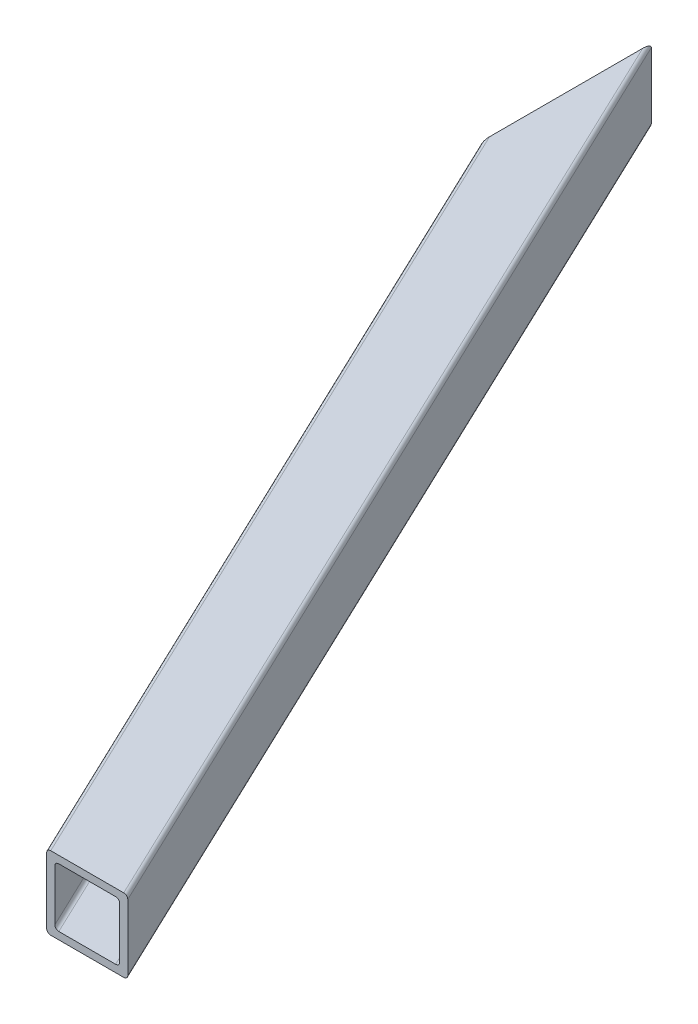
ISO-10303-21;
HEADER;
FILE_DESCRIPTION(('STEP AP214'),'2;1');
FILE_NAME('part.step','',(''),(''),'','','');
FILE_SCHEMA(('AUTOMOTIVE_DESIGN { 1 0 10303 214 1 1 1 1 }'));
ENDSEC;
DATA;
#1=APPLICATION_CONTEXT('core data for automotive mechanical design processes');
#2=APPLICATION_PROTOCOL_DEFINITION('international standard','automotive_design',2000,#1);
#3=PRODUCT_CONTEXT('',#1,'mechanical');
#4=PRODUCT('Part','Part','',(#3));
#5=PRODUCT_RELATED_PRODUCT_CATEGORY('part','',(#4));
#6=PRODUCT_DEFINITION_FORMATION('','',#4);
#7=PRODUCT_DEFINITION_CONTEXT('part definition',#1,'design');
#8=PRODUCT_DEFINITION('design','',#6,#7);
#9=PRODUCT_DEFINITION_SHAPE('','',#8);
#10=(LENGTH_UNIT() NAMED_UNIT(*) SI_UNIT(.MILLI.,.METRE.));
#11=(NAMED_UNIT(*) PLANE_ANGLE_UNIT() SI_UNIT($,.RADIAN.));
#12=(NAMED_UNIT(*) SI_UNIT($,.STERADIAN.) SOLID_ANGLE_UNIT());
#13=UNCERTAINTY_MEASURE_WITH_UNIT(LENGTH_MEASURE(1.E-05),#10,'distance_accuracy_value','');
#14=(GEOMETRIC_REPRESENTATION_CONTEXT(3) GLOBAL_UNCERTAINTY_ASSIGNED_CONTEXT((#13)) GLOBAL_UNIT_ASSIGNED_CONTEXT((#10,
#11,#12)) REPRESENTATION_CONTEXT('',''));
#15=CARTESIAN_POINT('',(0.,0.,0.));
#16=DIRECTION('',(0.,0.,1.));
#17=DIRECTION('',(1.,0.,0.));
#18=AXIS2_PLACEMENT_3D('',#15,#16,#17);
#19=CARTESIAN_POINT('',(0.,40.,-452.962373203096));
#20=DIRECTION('',(1.,0.,0.));
#21=DIRECTION('',(0.,0.,-1.));
#22=AXIS2_PLACEMENT_3D('',#19,#20,#21);
#23=PLANE('',#22);
#24=DIRECTION('',(0.,0.,-1.));
#25=VECTOR('',#24,1.);
#26=CARTESIAN_POINT('',(0.,4.,-452.962373203096));
#27=LINE('',#26,#25);
#28=CARTESIAN_POINT('',(0.,4.,-466.918017222632));
#29=VERTEX_POINT('',#28);
#30=CARTESIAN_POINT('',(0.,3.99999999999999,-532.044355980464));
#31=VERTEX_POINT('',#30);
#32=EDGE_CURVE('E254',#29,#31,#27,.T.);
#33=ORIENTED_EDGE('',*,*,#32,.T.);
#34=CARTESIAN_POINT('',(0.,6.,-532.044355980464));
#35=DIRECTION('',(1.,0.,0.));
#36=DIRECTION('',(0.,0.,-1.));
#37=AXIS2_PLACEMENT_3D('',#34,#35,#36);
#38=ELLIPSE('',#37,4.6518813398452,2.);
#39=CARTESIAN_POINT('',(0.,6.,-536.69623732031));
#40=VERTEX_POINT('',#39);
#41=EDGE_CURVE('E43',#31,#40,#38,.T.);
#42=ORIENTED_EDGE('',*,*,#41,.T.);
#43=DIRECTION('',(0.,1.,0.));
#44=VECTOR('',#43,1.);
#45=CARTESIAN_POINT('',(0.,40.,-536.69623732031));
#46=LINE('',#45,#44);
#47=CARTESIAN_POINT('',(0.,34.,-536.69623732031));
#48=VERTEX_POINT('',#47);
#49=EDGE_CURVE('E252',#40,#48,#46,.T.);
#50=ORIENTED_EDGE('',*,*,#49,.T.);
#51=CARTESIAN_POINT('',(0.,34.,-532.044355980465));
#52=DIRECTION('',(1.,0.,0.));
#53=DIRECTION('',(0.,0.,1.));
#54=AXIS2_PLACEMENT_3D('',#51,#52,#53);
#55=ELLIPSE('',#54,4.6518813398452,2.);
#56=CARTESIAN_POINT('',(0.,36.,-532.044355980464));
#57=VERTEX_POINT('',#56);
#58=EDGE_CURVE('E237',#48,#57,#55,.T.);
#59=ORIENTED_EDGE('',*,*,#58,.T.);
#60=DIRECTION('',(0.,0.,1.));
#61=VECTOR('',#60,1.);
#62=CARTESIAN_POINT('',(0.,36.,-452.962373203096));
#63=LINE('',#62,#61);
#64=CARTESIAN_POINT('',(0.,36.,-466.918017222632));
#65=VERTEX_POINT('',#64);
#66=EDGE_CURVE('E179',#57,#65,#63,.T.);
#67=ORIENTED_EDGE('',*,*,#66,.T.);
#68=CARTESIAN_POINT('',(0.,34.,-466.918017222632));
#69=DIRECTION('',(1.,0.,0.));
#70=DIRECTION('',(0.,0.,-1.));
#71=AXIS2_PLACEMENT_3D('',#68,#69,#70);
#72=ELLIPSE('',#71,4.6518813398452,2.);
#73=CARTESIAN_POINT('',(0.,34.,-462.266135882787));
#74=VERTEX_POINT('',#73);
#75=EDGE_CURVE('E243',#65,#74,#72,.T.);
#76=ORIENTED_EDGE('',*,*,#75,.T.);
#77=DIRECTION('',(0.,-1.,0.));
#78=VECTOR('',#77,1.);
#79=CARTESIAN_POINT('',(0.,40.,-462.266135882787));
#80=LINE('',#79,#78);
#81=CARTESIAN_POINT('',(0.,6.,-462.266135882787));
#82=VERTEX_POINT('',#81);
#83=EDGE_CURVE('E277',#74,#82,#80,.T.);
#84=ORIENTED_EDGE('',*,*,#83,.T.);
#85=CARTESIAN_POINT('',(0.,6.,-466.918017222632));
#86=DIRECTION('',(1.,0.,0.));
#87=DIRECTION('',(0.,0.,1.));
#88=AXIS2_PLACEMENT_3D('',#85,#86,#87);
#89=ELLIPSE('',#88,4.6518813398452,2.);
#90=EDGE_CURVE('E247',#82,#29,#89,.T.);
#91=ORIENTED_EDGE('',*,*,#90,.T.);
#92=EDGE_LOOP('',(#33,#42,#50,#59,#67,#76,#84,#91));
#93=FACE_BOUND('',#92,.T.);
#94=DIRECTION('',(0.,-1.,0.));
#95=VECTOR('',#94,1.);
#96=CARTESIAN_POINT('',(0.,40.,-452.962373203096));
#97=LINE('',#96,#95);
#98=CARTESIAN_POINT('',(0.,38.,-452.962373203096));
#99=VERTEX_POINT('',#98);
#100=CARTESIAN_POINT('',(0.,2.,-452.962373203096));
#101=VERTEX_POINT('',#100);
#102=EDGE_CURVE('E167',#99,#101,#97,.T.);
#103=ORIENTED_EDGE('',*,*,#102,.F.);
#104=CARTESIAN_POINT('',(0.,38.,-457.614254542941));
#105=DIRECTION('',(1.,0.,0.));
#106=DIRECTION('',(0.,0.,1.));
#107=AXIS2_PLACEMENT_3D('',#104,#105,#106);
#108=ELLIPSE('',#107,4.6518813398452,2.);
#109=CARTESIAN_POINT('',(0.,40.,-457.614254542941));
#110=VERTEX_POINT('',#109);
#111=EDGE_CURVE('E154',#99,#110,#108,.F.);
#112=ORIENTED_EDGE('',*,*,#111,.T.);
#113=DIRECTION('',(0.,0.,1.));
#114=VECTOR('',#113,1.);
#115=CARTESIAN_POINT('',(0.,40.,-452.962373203096));
#116=LINE('',#115,#114);
#117=CARTESIAN_POINT('',(0.,40.,-541.348118660155));
#118=VERTEX_POINT('',#117);
#119=EDGE_CURVE('E162',#118,#110,#116,.T.);
#120=ORIENTED_EDGE('',*,*,#119,.F.);
#121=CARTESIAN_POINT('',(0.,38.,-541.348118660155));
#122=DIRECTION('',(1.,0.,0.));
#123=DIRECTION('',(0.,0.,-1.));
#124=AXIS2_PLACEMENT_3D('',#121,#122,#123);
#125=ELLIPSE('',#124,4.6518813398452,2.);
#126=CARTESIAN_POINT('',(0.,38.,-546.));
#127=VERTEX_POINT('',#126);
#128=EDGE_CURVE('E58',#118,#127,#125,.F.);
#129=ORIENTED_EDGE('',*,*,#128,.T.);
#130=DIRECTION('',(0.,-1.,0.));
#131=VECTOR('',#130,1.);
#132=CARTESIAN_POINT('',(0.,40.,-546.));
#133=LINE('',#132,#131);
#134=CARTESIAN_POINT('',(0.,2.,-546.));
#135=VERTEX_POINT('',#134);
#136=EDGE_CURVE('E173',#127,#135,#133,.T.);
#137=ORIENTED_EDGE('',*,*,#136,.T.);
#138=CARTESIAN_POINT('',(0.,2.,-541.348118660155));
#139=DIRECTION('',(1.,0.,0.));
#140=DIRECTION('',(0.,0.,1.));
#141=AXIS2_PLACEMENT_3D('',#138,#139,#140);
#142=ELLIPSE('',#141,4.6518813398452,2.);
#143=CARTESIAN_POINT('',(0.,0.,-541.348118660155));
#144=VERTEX_POINT('',#143);
#145=EDGE_CURVE('E50',#135,#144,#142,.F.);
#146=ORIENTED_EDGE('',*,*,#145,.T.);
#147=DIRECTION('',(0.,0.,1.));
#148=VECTOR('',#147,1.);
#149=CARTESIAN_POINT('',(0.,0.,-452.962373203096));
#150=LINE('',#149,#148);
#151=CARTESIAN_POINT('',(0.,0.,-457.614254542941));
#152=VERTEX_POINT('',#151);
#153=EDGE_CURVE('E176',#144,#152,#150,.T.);
#154=ORIENTED_EDGE('',*,*,#153,.T.);
#155=CARTESIAN_POINT('',(0.,2.,-457.614254542941));
#156=DIRECTION('',(1.,0.,0.));
#157=DIRECTION('',(0.,0.,-1.));
#158=AXIS2_PLACEMENT_3D('',#155,#156,#157);
#159=ELLIPSE('',#158,4.6518813398452,2.);
#160=EDGE_CURVE('E155',#152,#101,#159,.F.);
#161=ORIENTED_EDGE('',*,*,#160,.T.);
#162=EDGE_LOOP('',(#103,#112,#120,#129,#137,#146,#154,#161));
#163=FACE_BOUND('',#162,.T.);
#164=ADVANCED_FACE('F35',(#93,#163),#23,.F.);
#165=CARTESIAN_POINT('',(0.,40.,-452.962373203096));
#166=DIRECTION('',(0.90286051882393,0.,-0.429933580392348));
#167=DIRECTION('',(-0.429933580392348,0.,-0.90286051882393));
#168=AXIS2_PLACEMENT_3D('',#165,#166,#167);
#169=PLANE('',#168);
#170=DIRECTION('',(0.,-1.,0.));
#171=VECTOR('',#170,1.);
#172=CARTESIAN_POINT('',(215.696368191951,40.,0.));
#173=LINE('',#172,#171);
#174=CARTESIAN_POINT('',(215.696368191951,38.,0.));
#175=VERTEX_POINT('',#174);
#176=CARTESIAN_POINT('',(215.696368191951,2.,0.));
#177=VERTEX_POINT('',#176);
#178=EDGE_CURVE('E188',#175,#177,#173,.T.);
#179=ORIENTED_EDGE('',*,*,#178,.F.);
#180=DIRECTION('',(0.429933580392348,0.,0.90286051882393));
#181=VECTOR('',#180,1.);
#182=CARTESIAN_POINT('',(0.,38.,-452.962373203096));
#183=LINE('',#182,#181);
#184=EDGE_CURVE('E205',#175,#99,#183,.F.);
#185=ORIENTED_EDGE('',*,*,#184,.T.);
#186=ORIENTED_EDGE('',*,*,#102,.T.);
#187=DIRECTION('',(0.429933580392348,0.,0.90286051882393));
#188=VECTOR('',#187,1.);
#189=CARTESIAN_POINT('',(215.696368191951,2.,0.));
#190=LINE('',#189,#188);
#191=EDGE_CURVE('E202',#101,#177,#190,.T.);
#192=ORIENTED_EDGE('',*,*,#191,.T.);
#193=EDGE_LOOP('',(#179,#185,#186,#192));
#194=FACE_BOUND('',#193,.T.);
#195=ADVANCED_FACE('F316',(#194),#169,.F.);
#196=CARTESIAN_POINT('',(215.696368191951,40.,0.));
#197=DIRECTION('',(0.,0.,-1.));
#198=DIRECTION('',(-1.,0.,0.));
#199=AXIS2_PLACEMENT_3D('',#196,#197,#198);
#200=PLANE('',#199);
#201=DIRECTION('',(-1.,0.,0.));
#202=VECTOR('',#201,1.);
#203=CARTESIAN_POINT('',(215.696368191951,4.,0.));
#204=LINE('',#203,#202);
#205=CARTESIAN_POINT('',(253.354455228793,3.99999999999999,0.));
#206=VERTEX_POINT('',#205);
#207=CARTESIAN_POINT('',(222.341912963158,4.,0.));
#208=VERTEX_POINT('',#207);
#209=EDGE_CURVE('E273',#206,#208,#204,.T.);
#210=ORIENTED_EDGE('',*,*,#209,.T.);
#211=CARTESIAN_POINT('',(222.341912963158,6.,0.));
#212=DIRECTION('',(0.,0.,-1.));
#213=DIRECTION('',(1.,0.,0.));
#214=AXIS2_PLACEMENT_3D('',#211,#212,#213);
#215=ELLIPSE('',#214,2.21518159040248,2.);
#216=CARTESIAN_POINT('',(220.126731372756,6.,0.));
#217=VERTEX_POINT('',#216);
#218=EDGE_CURVE('E245',#208,#217,#215,.T.);
#219=ORIENTED_EDGE('',*,*,#218,.T.);
#220=DIRECTION('',(0.,1.,0.));
#221=VECTOR('',#220,1.);
#222=CARTESIAN_POINT('',(220.126731372756,40.,0.));
#223=LINE('',#222,#221);
#224=CARTESIAN_POINT('',(220.126731372756,34.,0.));
#225=VERTEX_POINT('',#224);
#226=EDGE_CURVE('E263',#217,#225,#223,.T.);
#227=ORIENTED_EDGE('',*,*,#226,.T.);
#228=CARTESIAN_POINT('',(222.341912963158,34.,0.));
#229=DIRECTION('',(0.,0.,-1.));
#230=DIRECTION('',(-1.,0.,0.));
#231=AXIS2_PLACEMENT_3D('',#228,#229,#230);
#232=ELLIPSE('',#231,2.21518159040248,2.);
#233=CARTESIAN_POINT('',(222.341912963158,36.,0.));
#234=VERTEX_POINT('',#233);
#235=EDGE_CURVE('E241',#225,#234,#232,.T.);
#236=ORIENTED_EDGE('',*,*,#235,.T.);
#237=DIRECTION('',(1.,0.,0.));
#238=VECTOR('',#237,1.);
#239=CARTESIAN_POINT('',(215.696368191951,36.,0.));
#240=LINE('',#239,#238);
#241=CARTESIAN_POINT('',(253.354455228793,36.,0.));
#242=VERTEX_POINT('',#241);
#243=EDGE_CURVE('E279',#234,#242,#240,.T.);
#244=ORIENTED_EDGE('',*,*,#243,.T.);
#245=CARTESIAN_POINT('',(253.354455228793,34.,0.));
#246=DIRECTION('',(0.,0.,-1.));
#247=DIRECTION('',(1.,0.,0.));
#248=AXIS2_PLACEMENT_3D('',#245,#246,#247);
#249=ELLIPSE('',#248,2.21518159040248,2.);
#250=CARTESIAN_POINT('',(255.569636819195,34.,0.));
#251=VERTEX_POINT('',#250);
#252=EDGE_CURVE('E239',#242,#251,#249,.T.);
#253=ORIENTED_EDGE('',*,*,#252,.T.);
#254=DIRECTION('',(0.,-1.,0.));
#255=VECTOR('',#254,1.);
#256=CARTESIAN_POINT('',(255.569636819195,40.,0.));
#257=LINE('',#256,#255);
#258=CARTESIAN_POINT('',(255.569636819195,6.,0.));
#259=VERTEX_POINT('',#258);
#260=EDGE_CURVE('E264',#251,#259,#257,.T.);
#261=ORIENTED_EDGE('',*,*,#260,.T.);
#262=CARTESIAN_POINT('',(253.354455228793,6.,0.));
#263=DIRECTION('',(0.,0.,-1.));
#264=DIRECTION('',(-1.,0.,0.));
#265=AXIS2_PLACEMENT_3D('',#262,#263,#264);
#266=ELLIPSE('',#265,2.21518159040248,2.);
#267=EDGE_CURVE('E11',#259,#206,#266,.T.);
#268=ORIENTED_EDGE('',*,*,#267,.T.);
#269=EDGE_LOOP('',(#210,#219,#227,#236,#244,#253,#261,#268));
#270=FACE_BOUND('',#269,.T.);
#271=DIRECTION('',(1.,0.,0.));
#272=VECTOR('',#271,1.);
#273=CARTESIAN_POINT('',(215.696368191951,40.,0.));
#274=LINE('',#273,#272);
#275=CARTESIAN_POINT('',(217.911549782353,40.,0.));
#276=VERTEX_POINT('',#275);
#277=CARTESIAN_POINT('',(257.784818409598,40.,0.));
#278=VERTEX_POINT('',#277);
#279=EDGE_CURVE('E165',#276,#278,#274,.T.);
#280=ORIENTED_EDGE('',*,*,#279,.F.);
#281=CARTESIAN_POINT('',(217.911549782353,38.,0.));
#282=DIRECTION('',(0.,0.,-1.));
#283=DIRECTION('',(1.,0.,0.));
#284=AXIS2_PLACEMENT_3D('',#281,#282,#283);
#285=ELLIPSE('',#284,2.21518159040248,2.);
#286=EDGE_CURVE('E200',#276,#175,#285,.F.);
#287=ORIENTED_EDGE('',*,*,#286,.T.);
#288=ORIENTED_EDGE('',*,*,#178,.T.);
#289=CARTESIAN_POINT('',(217.911549782353,2.,0.));
#290=DIRECTION('',(0.,0.,-1.));
#291=DIRECTION('',(-1.,0.,0.));
#292=AXIS2_PLACEMENT_3D('',#289,#290,#291);
#293=ELLIPSE('',#292,2.21518159040248,2.);
#294=CARTESIAN_POINT('',(217.911549782353,0.,0.));
#295=VERTEX_POINT('',#294);
#296=EDGE_CURVE('E196',#177,#295,#293,.F.);
#297=ORIENTED_EDGE('',*,*,#296,.T.);
#298=DIRECTION('',(1.,0.,0.));
#299=VECTOR('',#298,1.);
#300=CARTESIAN_POINT('',(215.696368191951,0.,0.));
#301=LINE('',#300,#299);
#302=CARTESIAN_POINT('',(257.784818409598,0.,0.));
#303=VERTEX_POINT('',#302);
#304=EDGE_CURVE('E171',#295,#303,#301,.T.);
#305=ORIENTED_EDGE('',*,*,#304,.T.);
#306=CARTESIAN_POINT('',(257.784818409598,2.,0.));
#307=DIRECTION('',(0.,0.,-1.));
#308=DIRECTION('',(1.,0.,0.));
#309=AXIS2_PLACEMENT_3D('',#306,#307,#308);
#310=ELLIPSE('',#309,2.21518159040248,2.);
#311=CARTESIAN_POINT('',(260.,2.,0.));
#312=VERTEX_POINT('',#311);
#313=EDGE_CURVE('E194',#303,#312,#310,.F.);
#314=ORIENTED_EDGE('',*,*,#313,.T.);
#315=DIRECTION('',(0.,-1.,0.));
#316=VECTOR('',#315,1.);
#317=CARTESIAN_POINT('',(260.,40.,0.));
#318=LINE('',#317,#316);
#319=CARTESIAN_POINT('',(260.,38.,0.));
#320=VERTEX_POINT('',#319);
#321=EDGE_CURVE('E185',#320,#312,#318,.T.);
#322=ORIENTED_EDGE('',*,*,#321,.F.);
#323=CARTESIAN_POINT('',(257.784818409598,38.,0.));
#324=DIRECTION('',(0.,0.,-1.));
#325=DIRECTION('',(-1.,0.,0.));
#326=AXIS2_PLACEMENT_3D('',#323,#324,#325);
#327=ELLIPSE('',#326,2.21518159040248,2.);
#328=EDGE_CURVE('E198',#320,#278,#327,.F.);
#329=ORIENTED_EDGE('',*,*,#328,.T.);
#330=EDGE_LOOP('',(#280,#287,#288,#297,#305,#314,#322,#329));
#331=FACE_BOUND('',#330,.T.);
#332=ADVANCED_FACE('F271',(#270,#331),#200,.F.);
#333=CARTESIAN_POINT('',(260.,40.,0.));
#334=DIRECTION('',(-0.90286051882393,0.,0.429933580392348));
#335=DIRECTION('',(0.429933580392348,0.,0.90286051882393));
#336=AXIS2_PLACEMENT_3D('',#333,#334,#335);
#337=PLANE('',#336);
#338=ORIENTED_EDGE('',*,*,#136,.F.);
#339=DIRECTION('',(-0.429933580392348,0.,-0.90286051882393));
#340=VECTOR('',#339,1.);
#341=CARTESIAN_POINT('',(260.,38.,0.));
#342=LINE('',#341,#340);
#343=EDGE_CURVE('E153',#127,#320,#342,.F.);
#344=ORIENTED_EDGE('',*,*,#343,.T.);
#345=ORIENTED_EDGE('',*,*,#321,.T.);
#346=DIRECTION('',(-0.429933580392348,0.,-0.90286051882393));
#347=VECTOR('',#346,1.);
#348=CARTESIAN_POINT('',(0.,2.,-546.));
#349=LINE('',#348,#347);
#350=EDGE_CURVE('E230',#312,#135,#349,.T.);
#351=ORIENTED_EDGE('',*,*,#350,.T.);
#352=EDGE_LOOP('',(#338,#344,#345,#351));
#353=FACE_BOUND('',#352,.T.);
#354=ADVANCED_FACE('F391',(#353),#337,.F.);
#355=CARTESIAN_POINT('',(0.,40.,0.));
#356=DIRECTION('',(0.,-1.,0.));
#357=DIRECTION('',(0.,0.,-1.));
#358=AXIS2_PLACEMENT_3D('',#355,#356,#357);
#359=PLANE('',#358);
#360=ORIENTED_EDGE('',*,*,#119,.T.);
#361=DIRECTION('',(0.429933580392348,0.,0.90286051882393));
#362=VECTOR('',#361,1.);
#363=CARTESIAN_POINT('',(177.632150561955,40.,-84.5867383628358));
#364=LINE('',#363,#362);
#365=EDGE_CURVE('E166',#110,#276,#364,.T.);
#366=ORIENTED_EDGE('',*,*,#365,.T.);
#367=ORIENTED_EDGE('',*,*,#279,.T.);
#368=DIRECTION('',(-0.429933580392348,0.,-0.90286051882393));
#369=VECTOR('',#368,1.);
#370=CARTESIAN_POINT('',(210.135129239617,40.,-100.06434725696));
#371=LINE('',#370,#369);
#372=EDGE_CURVE('E152',#278,#118,#371,.T.);
#373=ORIENTED_EDGE('',*,*,#372,.T.);
#374=EDGE_LOOP('',(#360,#366,#367,#373));
#375=FACE_BOUND('',#374,.T.);
#376=ADVANCED_FACE('F160',(#375),#359,.F.);
#377=CARTESIAN_POINT('',(0.,0.,0.));
#378=DIRECTION('',(0.,-1.,0.));
#379=DIRECTION('',(0.,0.,-1.));
#380=AXIS2_PLACEMENT_3D('',#377,#378,#379);
#381=PLANE('',#380);
#382=ORIENTED_EDGE('',*,*,#304,.F.);
#383=DIRECTION('',(0.429933580392348,0.,0.90286051882393));
#384=VECTOR('',#383,1.);
#385=CARTESIAN_POINT('',(1.80572103764785,0.,-453.822240363881));
#386=LINE('',#385,#384);
#387=EDGE_CURVE('E235',#295,#152,#386,.F.);
#388=ORIENTED_EDGE('',*,*,#387,.T.);
#389=ORIENTED_EDGE('',*,*,#153,.F.);
#390=DIRECTION('',(-0.429933580392348,0.,-0.90286051882393));
#391=VECTOR('',#390,1.);
#392=CARTESIAN_POINT('',(258.194278962352,0.,0.859867160784698));
#393=LINE('',#392,#391);
#394=EDGE_CURVE('E233',#144,#303,#393,.F.);
#395=ORIENTED_EDGE('',*,*,#394,.T.);
#396=EDGE_LOOP('',(#382,#388,#389,#395));
#397=FACE_BOUND('',#396,.T.);
#398=ADVANCED_FACE('F327',(#397),#381,.T.);
#399=CARTESIAN_POINT('',(3.61144207529572,40.,-454.682107524665));
#400=DIRECTION('',(0.90286051882393,0.,-0.429933580392348));
#401=DIRECTION('',(-0.429933580392348,0.,-0.90286051882393));
#402=AXIS2_PLACEMENT_3D('',#399,#400,#401);
#403=PLANE('',#402);
#404=ORIENTED_EDGE('',*,*,#83,.F.);
#405=DIRECTION('',(0.429933580392348,0.,0.90286051882393));
#406=VECTOR('',#405,1.);
#407=CARTESIAN_POINT('',(220.126731372756,34.,0.));
#408=LINE('',#407,#406);
#409=EDGE_CURVE('E221',#74,#225,#408,.T.);
#410=ORIENTED_EDGE('',*,*,#409,.T.);
#411=ORIENTED_EDGE('',*,*,#226,.F.);
#412=DIRECTION('',(0.429933580392348,0.,0.90286051882393));
#413=VECTOR('',#412,1.);
#414=CARTESIAN_POINT('',(3.61144207529572,6.,-454.682107524665));
#415=LINE('',#414,#413);
#416=EDGE_CURVE('E219',#217,#82,#415,.F.);
#417=ORIENTED_EDGE('',*,*,#416,.T.);
#418=EDGE_LOOP('',(#404,#410,#411,#417));
#419=FACE_BOUND('',#418,.T.);
#420=ADVANCED_FACE('F300',(#419),#403,.T.);
#421=CARTESIAN_POINT('',(256.388557924704,40.,1.71973432156939));
#422=DIRECTION('',(-0.90286051882393,0.,0.429933580392348));
#423=DIRECTION('',(0.429933580392348,0.,0.90286051882393));
#424=AXIS2_PLACEMENT_3D('',#421,#422,#423);
#425=PLANE('',#424);
#426=ORIENTED_EDGE('',*,*,#260,.F.);
#427=DIRECTION('',(-0.429933580392348,0.,-0.90286051882393));
#428=VECTOR('',#427,1.);
#429=CARTESIAN_POINT('',(0.,34.,-536.69623732031));
#430=LINE('',#429,#428);
#431=EDGE_CURVE('E212',#251,#48,#430,.T.);
#432=ORIENTED_EDGE('',*,*,#431,.T.);
#433=ORIENTED_EDGE('',*,*,#49,.F.);
#434=DIRECTION('',(-0.429933580392348,0.,-0.90286051882393));
#435=VECTOR('',#434,1.);
#436=CARTESIAN_POINT('',(256.388557924704,6.,1.71973432156939));
#437=LINE('',#436,#435);
#438=EDGE_CURVE('E210',#40,#259,#437,.F.);
#439=ORIENTED_EDGE('',*,*,#438,.T.);
#440=EDGE_LOOP('',(#426,#432,#433,#439));
#441=FACE_BOUND('',#440,.T.);
#442=ADVANCED_FACE('F260',(#441),#425,.T.);
#443=CARTESIAN_POINT('',(0.,36.,0.));
#444=DIRECTION('',(0.,-1.,0.));
#445=DIRECTION('',(0.,0.,-1.));
#446=AXIS2_PLACEMENT_3D('',#443,#444,#445);
#447=PLANE('',#446);
#448=ORIENTED_EDGE('',*,*,#66,.F.);
#449=DIRECTION('',(-0.429933580392348,0.,-0.90286051882393));
#450=VECTOR('',#449,1.);
#451=CARTESIAN_POINT('',(253.763915781547,36.,0.859867160784731));
#452=LINE('',#451,#450);
#453=EDGE_CURVE('E217',#57,#242,#452,.F.);
#454=ORIENTED_EDGE('',*,*,#453,.T.);
#455=ORIENTED_EDGE('',*,*,#243,.F.);
#456=DIRECTION('',(0.429933580392348,0.,0.90286051882393));
#457=VECTOR('',#456,1.);
#458=CARTESIAN_POINT('',(1.80572103764783,36.,-463.126003043571));
#459=LINE('',#458,#457);
#460=EDGE_CURVE('E215',#234,#65,#459,.F.);
#461=ORIENTED_EDGE('',*,*,#460,.T.);
#462=EDGE_LOOP('',(#448,#454,#455,#461));
#463=FACE_BOUND('',#462,.T.);
#464=ADVANCED_FACE('F330',(#463),#447,.T.);
#465=CARTESIAN_POINT('',(0.,4.,0.));
#466=DIRECTION('',(0.,-1.,0.));
#467=DIRECTION('',(0.,0.,-1.));
#468=AXIS2_PLACEMENT_3D('',#465,#466,#467);
#469=PLANE('',#468);
#470=ORIENTED_EDGE('',*,*,#32,.F.);
#471=DIRECTION('',(0.429933580392348,0.,0.90286051882393));
#472=VECTOR('',#471,1.);
#473=CARTESIAN_POINT('',(181.243592637251,4.,-86.3064726844052));
#474=LINE('',#473,#472);
#475=EDGE_CURVE('E227',#29,#208,#474,.T.);
#476=ORIENTED_EDGE('',*,*,#475,.T.);
#477=ORIENTED_EDGE('',*,*,#209,.F.);
#478=DIRECTION('',(-0.429933580392348,0.,-0.90286051882393));
#479=VECTOR('',#478,1.);
#480=CARTESIAN_POINT('',(206.523687164321,4.,-98.3446129353908));
#481=LINE('',#480,#479);
#482=EDGE_CURVE('E224',#206,#31,#481,.T.);
#483=ORIENTED_EDGE('',*,*,#482,.T.);
#484=EDGE_LOOP('',(#470,#476,#477,#483));
#485=FACE_BOUND('',#484,.T.);
#486=ADVANCED_FACE('F275',(#485),#469,.F.);
#487=CARTESIAN_POINT('',(177.632150561955,38.,-84.5867383628357));
#488=DIRECTION('',(0.429933580392348,0.,0.90286051882393));
#489=DIRECTION('',(0.90286051882393,0.,-0.429933580392348));
#490=AXIS2_PLACEMENT_3D('',#487,#488,#489);
#491=CYLINDRICAL_SURFACE('',#490,2.);
#492=ORIENTED_EDGE('',*,*,#111,.F.);
#493=ORIENTED_EDGE('',*,*,#184,.F.);
#494=ORIENTED_EDGE('',*,*,#286,.F.);
#495=ORIENTED_EDGE('',*,*,#365,.F.);
#496=EDGE_LOOP('',(#492,#493,#494,#495));
#497=FACE_BOUND('',#496,.T.);
#498=ADVANCED_FACE('F335',(#497),#491,.T.);
#499=CARTESIAN_POINT('',(254.582836887056,34.,2.57960148235409));
#500=DIRECTION('',(0.429933580392348,0.,0.90286051882393));
#501=DIRECTION('',(0.90286051882393,0.,-0.429933580392348));
#502=AXIS2_PLACEMENT_3D('',#499,#500,#501);
#503=CYLINDRICAL_SURFACE('',#502,2.);
#504=ORIENTED_EDGE('',*,*,#252,.F.);
#505=ORIENTED_EDGE('',*,*,#453,.F.);
#506=ORIENTED_EDGE('',*,*,#58,.F.);
#507=ORIENTED_EDGE('',*,*,#431,.F.);
#508=EDGE_LOOP('',(#504,#505,#506,#507));
#509=FACE_BOUND('',#508,.T.);
#510=ADVANCED_FACE('F313',(#509),#503,.F.);
#511=CARTESIAN_POINT('',(5.41716311294358,34.,-455.54197468545));
#512=DIRECTION('',(-0.429933580392348,0.,-0.90286051882393));
#513=DIRECTION('',(-0.90286051882393,0.,0.429933580392348));
#514=AXIS2_PLACEMENT_3D('',#511,#512,#513);
#515=CYLINDRICAL_SURFACE('',#514,2.);
#516=ORIENTED_EDGE('',*,*,#75,.F.);
#517=ORIENTED_EDGE('',*,*,#460,.F.);
#518=ORIENTED_EDGE('',*,*,#235,.F.);
#519=ORIENTED_EDGE('',*,*,#409,.F.);
#520=EDGE_LOOP('',(#516,#517,#518,#519));
#521=FACE_BOUND('',#520,.T.);
#522=ADVANCED_FACE('F296',(#521),#515,.F.);
#523=CARTESIAN_POINT('',(181.243592637251,6.,-86.3064726844052));
#524=DIRECTION('',(0.429933580392348,0.,0.90286051882393));
#525=DIRECTION('',(0.90286051882393,0.,-0.429933580392348));
#526=AXIS2_PLACEMENT_3D('',#523,#524,#525);
#527=CYLINDRICAL_SURFACE('',#526,2.);
#528=ORIENTED_EDGE('',*,*,#90,.F.);
#529=ORIENTED_EDGE('',*,*,#416,.F.);
#530=ORIENTED_EDGE('',*,*,#218,.F.);
#531=ORIENTED_EDGE('',*,*,#475,.F.);
#532=EDGE_LOOP('',(#528,#529,#530,#531));
#533=FACE_BOUND('',#532,.T.);
#534=ADVANCED_FACE('F305',(#533),#527,.F.);
#535=CARTESIAN_POINT('',(206.523687164321,6.,-98.3446129353908));
#536=DIRECTION('',(-0.429933580392348,0.,-0.90286051882393));
#537=DIRECTION('',(-0.90286051882393,0.,0.429933580392348));
#538=AXIS2_PLACEMENT_3D('',#535,#536,#537);
#539=CYLINDRICAL_SURFACE('',#538,2.);
#540=ORIENTED_EDGE('',*,*,#267,.F.);
#541=ORIENTED_EDGE('',*,*,#438,.F.);
#542=ORIENTED_EDGE('',*,*,#41,.F.);
#543=ORIENTED_EDGE('',*,*,#482,.F.);
#544=EDGE_LOOP('',(#540,#541,#542,#543));
#545=FACE_BOUND('',#544,.T.);
#546=ADVANCED_FACE('F267',(#545),#539,.F.);
#547=CARTESIAN_POINT('',(210.135129239617,38.,-100.06434725696));
#548=DIRECTION('',(-0.429933580392348,0.,-0.90286051882393));
#549=DIRECTION('',(-0.90286051882393,0.,0.429933580392348));
#550=AXIS2_PLACEMENT_3D('',#547,#548,#549);
#551=CYLINDRICAL_SURFACE('',#550,2.);
#552=ORIENTED_EDGE('',*,*,#328,.F.);
#553=ORIENTED_EDGE('',*,*,#343,.F.);
#554=ORIENTED_EDGE('',*,*,#128,.F.);
#555=ORIENTED_EDGE('',*,*,#372,.F.);
#556=EDGE_LOOP('',(#552,#553,#554,#555));
#557=FACE_BOUND('',#556,.T.);
#558=ADVANCED_FACE('F151',(#557),#551,.T.);
#559=CARTESIAN_POINT('',(1.80572103764786,2.,-453.822240363881));
#560=DIRECTION('',(-0.429933580392348,0.,-0.90286051882393));
#561=DIRECTION('',(-0.90286051882393,0.,0.429933580392348));
#562=AXIS2_PLACEMENT_3D('',#559,#560,#561);
#563=CYLINDRICAL_SURFACE('',#562,2.);
#564=ORIENTED_EDGE('',*,*,#160,.F.);
#565=ORIENTED_EDGE('',*,*,#387,.F.);
#566=ORIENTED_EDGE('',*,*,#296,.F.);
#567=ORIENTED_EDGE('',*,*,#191,.F.);
#568=EDGE_LOOP('',(#564,#565,#566,#567));
#569=FACE_BOUND('',#568,.T.);
#570=ADVANCED_FACE('F368',(#569),#563,.T.);
#571=CARTESIAN_POINT('',(258.194278962352,2.,0.859867160784695));
#572=DIRECTION('',(0.429933580392348,0.,0.90286051882393));
#573=DIRECTION('',(0.90286051882393,0.,-0.429933580392348));
#574=AXIS2_PLACEMENT_3D('',#571,#572,#573);
#575=CYLINDRICAL_SURFACE('',#574,2.);
#576=ORIENTED_EDGE('',*,*,#313,.F.);
#577=ORIENTED_EDGE('',*,*,#394,.F.);
#578=ORIENTED_EDGE('',*,*,#145,.F.);
#579=ORIENTED_EDGE('',*,*,#350,.F.);
#580=EDGE_LOOP('',(#576,#577,#578,#579));
#581=FACE_BOUND('',#580,.T.);
#582=ADVANCED_FACE('F37',(#581),#575,.T.);
#583=CLOSED_SHELL('',(#164,#195,#332,#354,#376,#398,#420,#442,#464,#486,#498,#510,#522,#534,
#546,#558,#570,#582));
#584=MANIFOLD_SOLID_BREP('B2',#583);
#585=ADVANCED_BREP_SHAPE_REPRESENTATION('',(#18,#584),#14);
#586=SHAPE_DEFINITION_REPRESENTATION(#9,#585);
ENDSEC;
END-ISO-10303-21;
